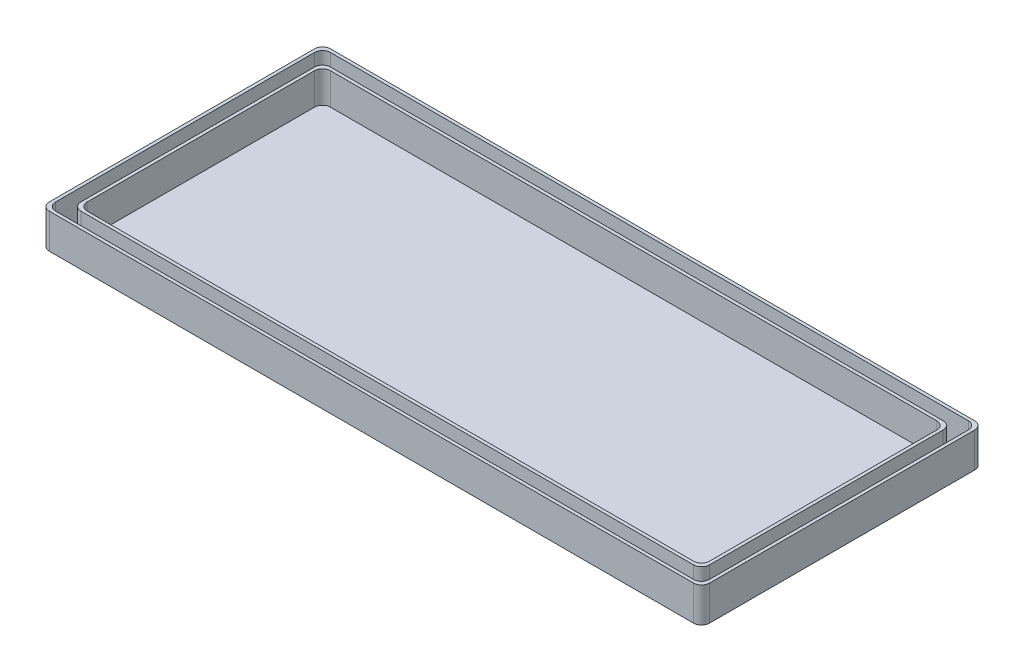
ISO-10303-21;
HEADER;
FILE_DESCRIPTION(('STEP AP214'),'2;1');
FILE_NAME('part.step','',(''),(''),'','','');
FILE_SCHEMA(('AUTOMOTIVE_DESIGN { 1 0 10303 214 1 1 1 1 }'));
ENDSEC;
DATA;
#1=APPLICATION_CONTEXT('core data for automotive mechanical design processes');
#2=APPLICATION_PROTOCOL_DEFINITION('international standard','automotive_design',2000,#1);
#3=PRODUCT_CONTEXT('',#1,'mechanical');
#4=PRODUCT('Part','Part','',(#3));
#5=PRODUCT_RELATED_PRODUCT_CATEGORY('part','',(#4));
#6=PRODUCT_DEFINITION_FORMATION('','',#4);
#7=PRODUCT_DEFINITION_CONTEXT('part definition',#1,'design');
#8=PRODUCT_DEFINITION('design','',#6,#7);
#9=PRODUCT_DEFINITION_SHAPE('','',#8);
#10=(LENGTH_UNIT() NAMED_UNIT(*) SI_UNIT(.MILLI.,.METRE.));
#11=(NAMED_UNIT(*) PLANE_ANGLE_UNIT() SI_UNIT($,.RADIAN.));
#12=(NAMED_UNIT(*) SI_UNIT($,.STERADIAN.) SOLID_ANGLE_UNIT());
#13=UNCERTAINTY_MEASURE_WITH_UNIT(LENGTH_MEASURE(1.E-05),#10,'distance_accuracy_value','');
#14=(GEOMETRIC_REPRESENTATION_CONTEXT(3) GLOBAL_UNCERTAINTY_ASSIGNED_CONTEXT((#13)) GLOBAL_UNIT_ASSIGNED_CONTEXT((#10,
#11,#12)) REPRESENTATION_CONTEXT('',''));
#15=CARTESIAN_POINT('',(0.,0.,0.));
#16=DIRECTION('',(0.,0.,1.));
#17=DIRECTION('',(1.,0.,0.));
#18=AXIS2_PLACEMENT_3D('',#15,#16,#17);
#19=CARTESIAN_POINT('',(0.,0.,0.));
#20=DIRECTION('',(0.,1.,0.));
#21=DIRECTION('',(0.,0.,1.));
#22=AXIS2_PLACEMENT_3D('',#19,#20,#21);
#23=PLANE('',#22);
#24=DIRECTION('',(0.,0.,1.));
#25=VECTOR('',#24,1.);
#26=CARTESIAN_POINT('',(-41.4,0.,17.4));
#27=LINE('',#26,#25);
#28=CARTESIAN_POINT('',(-41.4,0.,-16.4));
#29=VERTEX_POINT('',#28);
#30=CARTESIAN_POINT('',(-41.4,0.,16.4));
#31=VERTEX_POINT('',#30);
#32=EDGE_CURVE('E501',#29,#31,#27,.T.);
#33=ORIENTED_EDGE('',*,*,#32,.T.);
#34=CARTESIAN_POINT('',(-40.4,0.,16.4));
#35=DIRECTION('',(0.,1.,0.));
#36=DIRECTION('',(0.,0.,1.));
#37=AXIS2_PLACEMENT_3D('',#34,#35,#36);
#38=CIRCLE('',#37,1.);
#39=CARTESIAN_POINT('',(-40.4,0.,17.4));
#40=VERTEX_POINT('',#39);
#41=EDGE_CURVE('E350',#31,#40,#38,.T.);
#42=ORIENTED_EDGE('',*,*,#41,.T.);
#43=DIRECTION('',(1.,0.,0.));
#44=VECTOR('',#43,1.);
#45=CARTESIAN_POINT('',(41.4,0.,17.4));
#46=LINE('',#45,#44);
#47=CARTESIAN_POINT('',(40.4,0.,17.4));
#48=VERTEX_POINT('',#47);
#49=EDGE_CURVE('E507',#40,#48,#46,.T.);
#50=ORIENTED_EDGE('',*,*,#49,.T.);
#51=CARTESIAN_POINT('',(40.4,0.,16.4));
#52=DIRECTION('',(0.,1.,0.));
#53=DIRECTION('',(0.,0.,1.));
#54=AXIS2_PLACEMENT_3D('',#51,#52,#53);
#55=CIRCLE('',#54,1.);
#56=CARTESIAN_POINT('',(41.4,0.,16.4));
#57=VERTEX_POINT('',#56);
#58=EDGE_CURVE('E347',#48,#57,#55,.T.);
#59=ORIENTED_EDGE('',*,*,#58,.T.);
#60=DIRECTION('',(0.,0.,-1.));
#61=VECTOR('',#60,1.);
#62=CARTESIAN_POINT('',(41.4,0.,17.4));
#63=LINE('',#62,#61);
#64=CARTESIAN_POINT('',(41.4,0.,-16.4));
#65=VERTEX_POINT('',#64);
#66=EDGE_CURVE('E513',#57,#65,#63,.T.);
#67=ORIENTED_EDGE('',*,*,#66,.T.);
#68=CARTESIAN_POINT('',(40.4,0.,-16.4));
#69=DIRECTION('',(0.,1.,0.));
#70=DIRECTION('',(0.,0.,1.));
#71=AXIS2_PLACEMENT_3D('',#68,#69,#70);
#72=CIRCLE('',#71,1.);
#73=CARTESIAN_POINT('',(40.4,0.,-17.4));
#74=VERTEX_POINT('',#73);
#75=EDGE_CURVE('E344',#65,#74,#72,.T.);
#76=ORIENTED_EDGE('',*,*,#75,.T.);
#77=DIRECTION('',(-1.,0.,0.));
#78=VECTOR('',#77,1.);
#79=CARTESIAN_POINT('',(41.4,0.,-17.4));
#80=LINE('',#79,#78);
#81=CARTESIAN_POINT('',(-40.4,0.,-17.4));
#82=VERTEX_POINT('',#81);
#83=EDGE_CURVE('E502',#74,#82,#80,.T.);
#84=ORIENTED_EDGE('',*,*,#83,.T.);
#85=CARTESIAN_POINT('',(-40.4,0.,-16.4));
#86=DIRECTION('',(0.,1.,0.));
#87=DIRECTION('',(0.,0.,1.));
#88=AXIS2_PLACEMENT_3D('',#85,#86,#87);
#89=CIRCLE('',#88,1.);
#90=EDGE_CURVE('E341',#82,#29,#89,.T.);
#91=ORIENTED_EDGE('',*,*,#90,.T.);
#92=EDGE_LOOP('',(#33,#42,#50,#59,#67,#76,#84,#91));
#93=FACE_BOUND('',#92,.T.);
#94=DIRECTION('',(0.,0.,1.));
#95=VECTOR('',#94,1.);
#96=CARTESIAN_POINT('',(-39.8,0.,-15.8));
#97=LINE('',#96,#95);
#98=CARTESIAN_POINT('',(-39.8,0.,-14.8));
#99=VERTEX_POINT('',#98);
#100=CARTESIAN_POINT('',(-39.8,0.,14.8));
#101=VERTEX_POINT('',#100);
#102=EDGE_CURVE('E669',#99,#101,#97,.T.);
#103=ORIENTED_EDGE('',*,*,#102,.F.);
#104=CARTESIAN_POINT('',(-38.8,0.,-14.8));
#105=DIRECTION('',(0.,1.,0.));
#106=DIRECTION('',(0.,0.,1.));
#107=AXIS2_PLACEMENT_3D('',#104,#105,#106);
#108=CIRCLE('',#107,1.);
#109=CARTESIAN_POINT('',(-38.8,0.,-15.8));
#110=VERTEX_POINT('',#109);
#111=EDGE_CURVE('E471',#99,#110,#108,.F.);
#112=ORIENTED_EDGE('',*,*,#111,.T.);
#113=DIRECTION('',(-1.,0.,0.));
#114=VECTOR('',#113,1.);
#115=CARTESIAN_POINT('',(39.8,0.,-15.8));
#116=LINE('',#115,#114);
#117=CARTESIAN_POINT('',(38.8,0.,-15.8));
#118=VERTEX_POINT('',#117);
#119=EDGE_CURVE('E661',#118,#110,#116,.T.);
#120=ORIENTED_EDGE('',*,*,#119,.F.);
#121=CARTESIAN_POINT('',(38.8,0.,-14.8));
#122=DIRECTION('',(0.,1.,0.));
#123=DIRECTION('',(0.,0.,1.));
#124=AXIS2_PLACEMENT_3D('',#121,#122,#123);
#125=CIRCLE('',#124,1.);
#126=CARTESIAN_POINT('',(39.8,0.,-14.8));
#127=VERTEX_POINT('',#126);
#128=EDGE_CURVE('E468',#118,#127,#125,.F.);
#129=ORIENTED_EDGE('',*,*,#128,.T.);
#130=DIRECTION('',(0.,0.,-1.));
#131=VECTOR('',#130,1.);
#132=CARTESIAN_POINT('',(39.8,0.,15.8));
#133=LINE('',#132,#131);
#134=CARTESIAN_POINT('',(39.8,0.,14.8));
#135=VERTEX_POINT('',#134);
#136=EDGE_CURVE('E652',#135,#127,#133,.T.);
#137=ORIENTED_EDGE('',*,*,#136,.F.);
#138=CARTESIAN_POINT('',(38.8,0.,14.8));
#139=DIRECTION('',(0.,1.,0.));
#140=DIRECTION('',(0.,0.,1.));
#141=AXIS2_PLACEMENT_3D('',#138,#139,#140);
#142=CIRCLE('',#141,1.);
#143=CARTESIAN_POINT('',(38.8,0.,15.8));
#144=VERTEX_POINT('',#143);
#145=EDGE_CURVE('E459',#135,#144,#142,.F.);
#146=ORIENTED_EDGE('',*,*,#145,.T.);
#147=DIRECTION('',(1.,0.,0.));
#148=VECTOR('',#147,1.);
#149=CARTESIAN_POINT('',(-39.8,0.,15.8));
#150=LINE('',#149,#148);
#151=CARTESIAN_POINT('',(-38.8,0.,15.8));
#152=VERTEX_POINT('',#151);
#153=EDGE_CURVE('E665',#152,#144,#150,.T.);
#154=ORIENTED_EDGE('',*,*,#153,.F.);
#155=CARTESIAN_POINT('',(-38.8,0.,14.8));
#156=DIRECTION('',(0.,1.,0.));
#157=DIRECTION('',(0.,0.,1.));
#158=AXIS2_PLACEMENT_3D('',#155,#156,#157);
#159=CIRCLE('',#158,1.);
#160=EDGE_CURVE('E450',#152,#101,#159,.F.);
#161=ORIENTED_EDGE('',*,*,#160,.T.);
#162=EDGE_LOOP('',(#103,#112,#120,#129,#137,#146,#154,#161));
#163=FACE_BOUND('',#162,.T.);
#164=ADVANCED_FACE('F39',(#93,#163),#23,.T.);
#165=CARTESIAN_POINT('',(-41.8,4.,17.4));
#166=DIRECTION('',(1.,0.,0.));
#167=DIRECTION('',(0.,0.,-1.));
#168=AXIS2_PLACEMENT_3D('',#165,#166,#167);
#169=PLANE('',#168);
#170=DIRECTION('',(0.,0.,1.));
#171=VECTOR('',#170,1.);
#172=CARTESIAN_POINT('',(-41.8,-0.4,17.4));
#173=LINE('',#172,#171);
#174=CARTESIAN_POINT('',(-41.8,-0.4,-16.8));
#175=VERTEX_POINT('',#174);
#176=CARTESIAN_POINT('',(-41.8,-0.4,16.8));
#177=VERTEX_POINT('',#176);
#178=EDGE_CURVE('E493',#175,#177,#173,.T.);
#179=ORIENTED_EDGE('',*,*,#178,.T.);
#180=DIRECTION('',(0.,-1.,0.));
#181=VECTOR('',#180,1.);
#182=CARTESIAN_POINT('',(-41.8,4.,16.8));
#183=LINE('',#182,#181);
#184=CARTESIAN_POINT('',(-41.8,4.,16.8));
#185=VERTEX_POINT('',#184);
#186=EDGE_CURVE('E383',#177,#185,#183,.F.);
#187=ORIENTED_EDGE('',*,*,#186,.T.);
#188=DIRECTION('',(0.,0.,1.));
#189=VECTOR('',#188,1.);
#190=CARTESIAN_POINT('',(-41.8,4.,17.4));
#191=LINE('',#190,#189);
#192=CARTESIAN_POINT('',(-41.8,4.,-16.8));
#193=VERTEX_POINT('',#192);
#194=EDGE_CURVE('E539',#193,#185,#191,.T.);
#195=ORIENTED_EDGE('',*,*,#194,.F.);
#196=DIRECTION('',(0.,-1.,0.));
#197=VECTOR('',#196,1.);
#198=CARTESIAN_POINT('',(-41.8,4.,-16.8));
#199=LINE('',#198,#197);
#200=EDGE_CURVE('E379',#193,#175,#199,.T.);
#201=ORIENTED_EDGE('',*,*,#200,.T.);
#202=EDGE_LOOP('',(#179,#187,#195,#201));
#203=FACE_BOUND('',#202,.T.);
#204=ADVANCED_FACE('F568',(#203),#169,.F.);
#205=CARTESIAN_POINT('',(41.4,4.,17.8));
#206=DIRECTION('',(0.,0.,-1.));
#207=DIRECTION('',(-1.,0.,0.));
#208=AXIS2_PLACEMENT_3D('',#205,#206,#207);
#209=PLANE('',#208);
#210=DIRECTION('',(1.,0.,0.));
#211=VECTOR('',#210,1.);
#212=CARTESIAN_POINT('',(41.4,4.,17.8));
#213=LINE('',#212,#211);
#214=CARTESIAN_POINT('',(-40.8,4.,17.8));
#215=VERTEX_POINT('',#214);
#216=CARTESIAN_POINT('',(40.8,4.,17.8));
#217=VERTEX_POINT('',#216);
#218=EDGE_CURVE('E543',#215,#217,#213,.T.);
#219=ORIENTED_EDGE('',*,*,#218,.F.);
#220=DIRECTION('',(0.,-1.,0.));
#221=VECTOR('',#220,1.);
#222=CARTESIAN_POINT('',(-40.8,4.,17.8));
#223=LINE('',#222,#221);
#224=CARTESIAN_POINT('',(-40.8,-0.4,17.8));
#225=VERTEX_POINT('',#224);
#226=EDGE_CURVE('E363',#215,#225,#223,.T.);
#227=ORIENTED_EDGE('',*,*,#226,.T.);
#228=DIRECTION('',(1.,0.,0.));
#229=VECTOR('',#228,1.);
#230=CARTESIAN_POINT('',(41.4,-0.4,17.8));
#231=LINE('',#230,#229);
#232=CARTESIAN_POINT('',(40.8,-0.4,17.8));
#233=VERTEX_POINT('',#232);
#234=EDGE_CURVE('E528',#225,#233,#231,.T.);
#235=ORIENTED_EDGE('',*,*,#234,.T.);
#236=DIRECTION('',(0.,-1.,0.));
#237=VECTOR('',#236,1.);
#238=CARTESIAN_POINT('',(40.8,4.,17.8));
#239=LINE('',#238,#237);
#240=EDGE_CURVE('E360',#233,#217,#239,.F.);
#241=ORIENTED_EDGE('',*,*,#240,.T.);
#242=EDGE_LOOP('',(#219,#227,#235,#241));
#243=FACE_BOUND('',#242,.T.);
#244=ADVANCED_FACE('F576',(#243),#209,.F.);
#245=CARTESIAN_POINT('',(41.8,4.,17.4));
#246=DIRECTION('',(-1.,0.,0.));
#247=DIRECTION('',(0.,0.,1.));
#248=AXIS2_PLACEMENT_3D('',#245,#246,#247);
#249=PLANE('',#248);
#250=DIRECTION('',(0.,0.,-1.));
#251=VECTOR('',#250,1.);
#252=CARTESIAN_POINT('',(41.8,4.,17.4));
#253=LINE('',#252,#251);
#254=CARTESIAN_POINT('',(41.8,4.,16.8));
#255=VERTEX_POINT('',#254);
#256=CARTESIAN_POINT('',(41.8,4.,-16.8));
#257=VERTEX_POINT('',#256);
#258=EDGE_CURVE('E285',#255,#257,#253,.T.);
#259=ORIENTED_EDGE('',*,*,#258,.F.);
#260=DIRECTION('',(0.,-1.,0.));
#261=VECTOR('',#260,1.);
#262=CARTESIAN_POINT('',(41.8,4.,16.8));
#263=LINE('',#262,#261);
#264=CARTESIAN_POINT('',(41.8,-0.4,16.8));
#265=VERTEX_POINT('',#264);
#266=EDGE_CURVE('E414',#255,#265,#263,.T.);
#267=ORIENTED_EDGE('',*,*,#266,.T.);
#268=DIRECTION('',(0.,0.,-1.));
#269=VECTOR('',#268,1.);
#270=CARTESIAN_POINT('',(41.8,-0.4,17.4));
#271=LINE('',#270,#269);
#272=CARTESIAN_POINT('',(41.8,-0.4,-16.8));
#273=VERTEX_POINT('',#272);
#274=EDGE_CURVE('E532',#265,#273,#271,.T.);
#275=ORIENTED_EDGE('',*,*,#274,.T.);
#276=DIRECTION('',(0.,-1.,0.));
#277=VECTOR('',#276,1.);
#278=CARTESIAN_POINT('',(41.8,4.,-16.8));
#279=LINE('',#278,#277);
#280=EDGE_CURVE('E411',#273,#257,#279,.F.);
#281=ORIENTED_EDGE('',*,*,#280,.T.);
#282=EDGE_LOOP('',(#259,#267,#275,#281));
#283=FACE_BOUND('',#282,.T.);
#284=ADVANCED_FACE('F580',(#283),#249,.F.);
#285=CARTESIAN_POINT('',(41.4,4.,-17.8));
#286=DIRECTION('',(0.,0.,1.));
#287=DIRECTION('',(1.,0.,0.));
#288=AXIS2_PLACEMENT_3D('',#285,#286,#287);
#289=PLANE('',#288);
#290=DIRECTION('',(-1.,0.,0.));
#291=VECTOR('',#290,1.);
#292=CARTESIAN_POINT('',(41.4,4.,-17.8));
#293=LINE('',#292,#291);
#294=CARTESIAN_POINT('',(40.8,4.,-17.8));
#295=VERTEX_POINT('',#294);
#296=CARTESIAN_POINT('',(-40.8,4.,-17.8));
#297=VERTEX_POINT('',#296);
#298=EDGE_CURVE('E279',#295,#297,#293,.T.);
#299=ORIENTED_EDGE('',*,*,#298,.F.);
#300=DIRECTION('',(0.,-1.,0.));
#301=VECTOR('',#300,1.);
#302=CARTESIAN_POINT('',(40.8,4.,-17.8));
#303=LINE('',#302,#301);
#304=CARTESIAN_POINT('',(40.8,-0.4,-17.8));
#305=VERTEX_POINT('',#304);
#306=EDGE_CURVE('E420',#295,#305,#303,.T.);
#307=ORIENTED_EDGE('',*,*,#306,.T.);
#308=DIRECTION('',(-1.,0.,0.));
#309=VECTOR('',#308,1.);
#310=CARTESIAN_POINT('',(41.4,-0.4,-17.8));
#311=LINE('',#310,#309);
#312=CARTESIAN_POINT('',(-40.8,-0.4,-17.8));
#313=VERTEX_POINT('',#312);
#314=EDGE_CURVE('E536',#305,#313,#311,.T.);
#315=ORIENTED_EDGE('',*,*,#314,.T.);
#316=DIRECTION('',(0.,-1.,0.));
#317=VECTOR('',#316,1.);
#318=CARTESIAN_POINT('',(-40.8,4.,-17.8));
#319=LINE('',#318,#317);
#320=EDGE_CURVE('E55',#313,#297,#319,.F.);
#321=ORIENTED_EDGE('',*,*,#320,.T.);
#322=EDGE_LOOP('',(#299,#307,#315,#321));
#323=FACE_BOUND('',#322,.T.);
#324=ADVANCED_FACE('F556',(#323),#289,.F.);
#325=CARTESIAN_POINT('',(0.,4.,0.));
#326=DIRECTION('',(0.,1.,0.));
#327=DIRECTION('',(0.,0.,1.));
#328=AXIS2_PLACEMENT_3D('',#325,#326,#327);
#329=PLANE('',#328);
#330=DIRECTION('',(0.,0.,1.));
#331=VECTOR('',#330,1.);
#332=CARTESIAN_POINT('',(-41.4,4.,17.4));
#333=LINE('',#332,#331);
#334=CARTESIAN_POINT('',(-41.4,4.,-16.4));
#335=VERTEX_POINT('',#334);
#336=CARTESIAN_POINT('',(-41.4,4.,16.4));
#337=VERTEX_POINT('',#336);
#338=EDGE_CURVE('E483',#335,#337,#333,.T.);
#339=ORIENTED_EDGE('',*,*,#338,.F.);
#340=CARTESIAN_POINT('',(-40.4,4.,-16.4));
#341=DIRECTION('',(0.,1.,0.));
#342=DIRECTION('',(0.,0.,1.));
#343=AXIS2_PLACEMENT_3D('',#340,#341,#342);
#344=CIRCLE('',#343,1.);
#345=CARTESIAN_POINT('',(-40.4,4.,-17.4));
#346=VERTEX_POINT('',#345);
#347=EDGE_CURVE('E48',#335,#346,#344,.F.);
#348=ORIENTED_EDGE('',*,*,#347,.T.);
#349=DIRECTION('',(-1.,0.,0.));
#350=VECTOR('',#349,1.);
#351=CARTESIAN_POINT('',(41.4,4.,-17.4));
#352=LINE('',#351,#350);
#353=CARTESIAN_POINT('',(40.4,4.,-17.4));
#354=VERTEX_POINT('',#353);
#355=EDGE_CURVE('E480',#354,#346,#352,.T.);
#356=ORIENTED_EDGE('',*,*,#355,.F.);
#357=CARTESIAN_POINT('',(40.4,4.,-16.4));
#358=DIRECTION('',(0.,1.,0.));
#359=DIRECTION('',(0.,0.,1.));
#360=AXIS2_PLACEMENT_3D('',#357,#358,#359);
#361=CIRCLE('',#360,1.);
#362=CARTESIAN_POINT('',(41.4,4.,-16.4));
#363=VERTEX_POINT('',#362);
#364=EDGE_CURVE('E462',#354,#363,#361,.F.);
#365=ORIENTED_EDGE('',*,*,#364,.T.);
#366=DIRECTION('',(0.,0.,-1.));
#367=VECTOR('',#366,1.);
#368=CARTESIAN_POINT('',(41.4,4.,17.4));
#369=LINE('',#368,#367);
#370=CARTESIAN_POINT('',(41.4,4.,16.4));
#371=VERTEX_POINT('',#370);
#372=EDGE_CURVE('E494',#371,#363,#369,.T.);
#373=ORIENTED_EDGE('',*,*,#372,.F.);
#374=CARTESIAN_POINT('',(40.4,4.,16.4));
#375=DIRECTION('',(0.,1.,0.));
#376=DIRECTION('',(0.,0.,1.));
#377=AXIS2_PLACEMENT_3D('',#374,#375,#376);
#378=CIRCLE('',#377,1.);
#379=CARTESIAN_POINT('',(40.4,4.,17.4));
#380=VERTEX_POINT('',#379);
#381=EDGE_CURVE('E456',#371,#380,#378,.F.);
#382=ORIENTED_EDGE('',*,*,#381,.T.);
#383=DIRECTION('',(1.,0.,0.));
#384=VECTOR('',#383,1.);
#385=CARTESIAN_POINT('',(41.4,4.,17.4));
#386=LINE('',#385,#384);
#387=CARTESIAN_POINT('',(-40.4,4.,17.4));
#388=VERTEX_POINT('',#387);
#389=EDGE_CURVE('E675',#388,#380,#386,.T.);
#390=ORIENTED_EDGE('',*,*,#389,.F.);
#391=CARTESIAN_POINT('',(-40.4,4.,16.4));
#392=DIRECTION('',(0.,1.,0.));
#393=DIRECTION('',(0.,0.,1.));
#394=AXIS2_PLACEMENT_3D('',#391,#392,#393);
#395=CIRCLE('',#394,1.);
#396=EDGE_CURVE('E453',#388,#337,#395,.F.);
#397=ORIENTED_EDGE('',*,*,#396,.T.);
#398=EDGE_LOOP('',(#339,#348,#356,#365,#373,#382,#390,#397));
#399=FACE_BOUND('',#398,.T.);
#400=ORIENTED_EDGE('',*,*,#194,.T.);
#401=CARTESIAN_POINT('',(-40.8,4.,16.8));
#402=DIRECTION('',(0.,1.,0.));
#403=DIRECTION('',(0.,0.,1.));
#404=AXIS2_PLACEMENT_3D('',#401,#402,#403);
#405=CIRCLE('',#404,1.);
#406=EDGE_CURVE('E394',#185,#215,#405,.T.);
#407=ORIENTED_EDGE('',*,*,#406,.T.);
#408=ORIENTED_EDGE('',*,*,#218,.T.);
#409=CARTESIAN_POINT('',(40.8,4.,16.8));
#410=DIRECTION('',(0.,1.,0.));
#411=DIRECTION('',(0.,0.,1.));
#412=AXIS2_PLACEMENT_3D('',#409,#410,#411);
#413=CIRCLE('',#412,1.);
#414=EDGE_CURVE('E391',#217,#255,#413,.T.);
#415=ORIENTED_EDGE('',*,*,#414,.T.);
#416=ORIENTED_EDGE('',*,*,#258,.T.);
#417=CARTESIAN_POINT('',(40.8,4.,-16.8));
#418=DIRECTION('',(0.,1.,0.));
#419=DIRECTION('',(0.,0.,1.));
#420=AXIS2_PLACEMENT_3D('',#417,#418,#419);
#421=CIRCLE('',#420,1.);
#422=EDGE_CURVE('E62',#257,#295,#421,.T.);
#423=ORIENTED_EDGE('',*,*,#422,.T.);
#424=ORIENTED_EDGE('',*,*,#298,.T.);
#425=CARTESIAN_POINT('',(-40.8,4.,-16.8));
#426=DIRECTION('',(0.,1.,0.));
#427=DIRECTION('',(0.,0.,1.));
#428=AXIS2_PLACEMENT_3D('',#425,#426,#427);
#429=CIRCLE('',#428,1.);
#430=EDGE_CURVE('E386',#297,#193,#429,.T.);
#431=ORIENTED_EDGE('',*,*,#430,.T.);
#432=EDGE_LOOP('',(#400,#407,#408,#415,#416,#423,#424,#431));
#433=FACE_BOUND('',#432,.T.);
#434=ADVANCED_FACE('F479',(#399,#433),#329,.T.);
#435=CARTESIAN_POINT('',(0.,-0.4,0.));
#436=DIRECTION('',(0.,1.,0.));
#437=DIRECTION('',(0.,0.,1.));
#438=AXIS2_PLACEMENT_3D('',#435,#436,#437);
#439=PLANE('',#438);
#440=ORIENTED_EDGE('',*,*,#234,.F.);
#441=CARTESIAN_POINT('',(-40.8,-0.4,16.8));
#442=DIRECTION('',(0.,1.,0.));
#443=DIRECTION('',(0.,0.,1.));
#444=AXIS2_PLACEMENT_3D('',#441,#442,#443);
#445=CIRCLE('',#444,1.);
#446=EDGE_CURVE('E376',#225,#177,#445,.F.);
#447=ORIENTED_EDGE('',*,*,#446,.T.);
#448=ORIENTED_EDGE('',*,*,#178,.F.);
#449=CARTESIAN_POINT('',(-40.8,-0.4,-16.8));
#450=DIRECTION('',(0.,1.,0.));
#451=DIRECTION('',(0.,0.,1.));
#452=AXIS2_PLACEMENT_3D('',#449,#450,#451);
#453=CIRCLE('',#452,1.);
#454=EDGE_CURVE('E367',#175,#313,#453,.F.);
#455=ORIENTED_EDGE('',*,*,#454,.T.);
#456=ORIENTED_EDGE('',*,*,#314,.F.);
#457=CARTESIAN_POINT('',(40.8,-0.4,-16.8));
#458=DIRECTION('',(0.,1.,0.));
#459=DIRECTION('',(0.,0.,1.));
#460=AXIS2_PLACEMENT_3D('',#457,#458,#459);
#461=CIRCLE('',#460,1.);
#462=EDGE_CURVE('E370',#305,#273,#461,.F.);
#463=ORIENTED_EDGE('',*,*,#462,.T.);
#464=ORIENTED_EDGE('',*,*,#274,.F.);
#465=CARTESIAN_POINT('',(40.8,-0.4,16.8));
#466=DIRECTION('',(0.,1.,0.));
#467=DIRECTION('',(0.,0.,1.));
#468=AXIS2_PLACEMENT_3D('',#465,#466,#467);
#469=CIRCLE('',#468,1.);
#470=EDGE_CURVE('E373',#265,#233,#469,.F.);
#471=ORIENTED_EDGE('',*,*,#470,.T.);
#472=EDGE_LOOP('',(#440,#447,#448,#455,#456,#463,#464,#471));
#473=FACE_BOUND('',#472,.T.);
#474=ADVANCED_FACE('F559',(#473),#439,.F.);
#475=CARTESIAN_POINT('',(-41.4,4.,17.4));
#476=DIRECTION('',(1.,0.,0.));
#477=DIRECTION('',(0.,0.,-1.));
#478=AXIS2_PLACEMENT_3D('',#475,#476,#477);
#479=PLANE('',#478);
#480=ORIENTED_EDGE('',*,*,#338,.T.);
#481=DIRECTION('',(0.,-1.,0.));
#482=VECTOR('',#481,1.);
#483=CARTESIAN_POINT('',(-41.4,0.,16.4));
#484=LINE('',#483,#482);
#485=EDGE_CURVE('E337',#337,#31,#484,.T.);
#486=ORIENTED_EDGE('',*,*,#485,.T.);
#487=ORIENTED_EDGE('',*,*,#32,.F.);
#488=DIRECTION('',(0.,-1.,0.));
#489=VECTOR('',#488,1.);
#490=CARTESIAN_POINT('',(-41.4,4.,-16.4));
#491=LINE('',#490,#489);
#492=EDGE_CURVE('E334',#29,#335,#491,.F.);
#493=ORIENTED_EDGE('',*,*,#492,.T.);
#494=EDGE_LOOP('',(#480,#486,#487,#493));
#495=FACE_BOUND('',#494,.T.);
#496=ADVANCED_FACE('F504',(#495),#479,.T.);
#497=CARTESIAN_POINT('',(41.4,4.,17.4));
#498=DIRECTION('',(0.,0.,-1.));
#499=DIRECTION('',(-1.,0.,0.));
#500=AXIS2_PLACEMENT_3D('',#497,#498,#499);
#501=PLANE('',#500);
#502=ORIENTED_EDGE('',*,*,#49,.F.);
#503=DIRECTION('',(0.,-1.,0.));
#504=VECTOR('',#503,1.);
#505=CARTESIAN_POINT('',(-40.4,4.,17.4));
#506=LINE('',#505,#504);
#507=EDGE_CURVE('E357',#40,#388,#506,.F.);
#508=ORIENTED_EDGE('',*,*,#507,.T.);
#509=ORIENTED_EDGE('',*,*,#389,.T.);
#510=DIRECTION('',(0.,-1.,0.));
#511=VECTOR('',#510,1.);
#512=CARTESIAN_POINT('',(40.4,0.,17.4));
#513=LINE('',#512,#511);
#514=EDGE_CURVE('E353',#380,#48,#513,.T.);
#515=ORIENTED_EDGE('',*,*,#514,.T.);
#516=EDGE_LOOP('',(#502,#508,#509,#515));
#517=FACE_BOUND('',#516,.T.);
#518=ADVANCED_FACE('F696',(#517),#501,.T.);
#519=CARTESIAN_POINT('',(41.4,4.,17.4));
#520=DIRECTION('',(-1.,0.,0.));
#521=DIRECTION('',(0.,0.,1.));
#522=AXIS2_PLACEMENT_3D('',#519,#520,#521);
#523=PLANE('',#522);
#524=ORIENTED_EDGE('',*,*,#66,.F.);
#525=DIRECTION('',(0.,-1.,0.));
#526=VECTOR('',#525,1.);
#527=CARTESIAN_POINT('',(41.4,4.,16.4));
#528=LINE('',#527,#526);
#529=EDGE_CURVE('E401',#57,#371,#528,.F.);
#530=ORIENTED_EDGE('',*,*,#529,.T.);
#531=ORIENTED_EDGE('',*,*,#372,.T.);
#532=DIRECTION('',(0.,-1.,0.));
#533=VECTOR('',#532,1.);
#534=CARTESIAN_POINT('',(41.4,0.,-16.4));
#535=LINE('',#534,#533);
#536=EDGE_CURVE('E397',#363,#65,#535,.T.);
#537=ORIENTED_EDGE('',*,*,#536,.T.);
#538=EDGE_LOOP('',(#524,#530,#531,#537));
#539=FACE_BOUND('',#538,.T.);
#540=ADVANCED_FACE('F684',(#539),#523,.T.);
#541=CARTESIAN_POINT('',(41.4,4.,-17.4));
#542=DIRECTION('',(0.,0.,1.));
#543=DIRECTION('',(1.,0.,0.));
#544=AXIS2_PLACEMENT_3D('',#541,#542,#543);
#545=PLANE('',#544);
#546=ORIENTED_EDGE('',*,*,#83,.F.);
#547=DIRECTION('',(0.,-1.,0.));
#548=VECTOR('',#547,1.);
#549=CARTESIAN_POINT('',(40.4,4.,-17.4));
#550=LINE('',#549,#548);
#551=EDGE_CURVE('E428',#74,#354,#550,.F.);
#552=ORIENTED_EDGE('',*,*,#551,.T.);
#553=ORIENTED_EDGE('',*,*,#355,.T.);
#554=DIRECTION('',(0.,-1.,0.));
#555=VECTOR('',#554,1.);
#556=CARTESIAN_POINT('',(-40.4,0.,-17.4));
#557=LINE('',#556,#555);
#558=EDGE_CURVE('E424',#346,#82,#557,.T.);
#559=ORIENTED_EDGE('',*,*,#558,.T.);
#560=EDGE_LOOP('',(#546,#552,#553,#559));
#561=FACE_BOUND('',#560,.T.);
#562=ADVANCED_FACE('F489',(#561),#545,.T.);
#563=CARTESIAN_POINT('',(0.,4.,0.));
#564=DIRECTION('',(0.,1.,0.));
#565=DIRECTION('',(0.,0.,1.));
#566=AXIS2_PLACEMENT_3D('',#563,#564,#565);
#567=PLANE('',#566);
#568=DIRECTION('',(0.,0.,1.));
#569=VECTOR('',#568,1.);
#570=CARTESIAN_POINT('',(-39.8,4.,-15.8));
#571=LINE('',#570,#569);
#572=CARTESIAN_POINT('',(-39.8,4.,-14.8));
#573=VERTEX_POINT('',#572);
#574=CARTESIAN_POINT('',(-39.8,4.,14.8));
#575=VERTEX_POINT('',#574);
#576=EDGE_CURVE('E651',#573,#575,#571,.T.);
#577=ORIENTED_EDGE('',*,*,#576,.T.);
#578=CARTESIAN_POINT('',(-38.8,4.,14.8));
#579=DIRECTION('',(0.,1.,0.));
#580=DIRECTION('',(0.,0.,1.));
#581=AXIS2_PLACEMENT_3D('',#578,#579,#580);
#582=CIRCLE('',#581,1.);
#583=CARTESIAN_POINT('',(-38.8,4.,15.8));
#584=VERTEX_POINT('',#583);
#585=EDGE_CURVE('E331',#575,#584,#582,.T.);
#586=ORIENTED_EDGE('',*,*,#585,.T.);
#587=DIRECTION('',(1.,0.,0.));
#588=VECTOR('',#587,1.);
#589=CARTESIAN_POINT('',(-39.8,4.,15.8));
#590=LINE('',#589,#588);
#591=CARTESIAN_POINT('',(38.8,4.,15.8));
#592=VERTEX_POINT('',#591);
#593=EDGE_CURVE('E516',#584,#592,#590,.T.);
#594=ORIENTED_EDGE('',*,*,#593,.T.);
#595=CARTESIAN_POINT('',(38.8,4.,14.8));
#596=DIRECTION('',(0.,1.,0.));
#597=DIRECTION('',(0.,0.,1.));
#598=AXIS2_PLACEMENT_3D('',#595,#596,#597);
#599=CIRCLE('',#598,1.);
#600=CARTESIAN_POINT('',(39.8,4.,14.8));
#601=VERTEX_POINT('',#600);
#602=EDGE_CURVE('E328',#592,#601,#599,.T.);
#603=ORIENTED_EDGE('',*,*,#602,.T.);
#604=DIRECTION('',(0.,0.,-1.));
#605=VECTOR('',#604,1.);
#606=CARTESIAN_POINT('',(39.8,4.,15.8));
#607=LINE('',#606,#605);
#608=CARTESIAN_POINT('',(39.8,4.,-14.8));
#609=VERTEX_POINT('',#608);
#610=EDGE_CURVE('E508',#601,#609,#607,.T.);
#611=ORIENTED_EDGE('',*,*,#610,.T.);
#612=CARTESIAN_POINT('',(38.8,4.,-14.8));
#613=DIRECTION('',(0.,1.,0.));
#614=DIRECTION('',(0.,0.,1.));
#615=AXIS2_PLACEMENT_3D('',#612,#613,#614);
#616=CIRCLE('',#615,1.);
#617=CARTESIAN_POINT('',(38.8,4.,-15.8));
#618=VERTEX_POINT('',#617);
#619=EDGE_CURVE('E325',#609,#618,#616,.T.);
#620=ORIENTED_EDGE('',*,*,#619,.T.);
#621=DIRECTION('',(-1.,0.,0.));
#622=VECTOR('',#621,1.);
#623=CARTESIAN_POINT('',(39.8,4.,-15.8));
#624=LINE('',#623,#622);
#625=CARTESIAN_POINT('',(-38.8,4.,-15.8));
#626=VERTEX_POINT('',#625);
#627=EDGE_CURVE('E644',#618,#626,#624,.T.);
#628=ORIENTED_EDGE('',*,*,#627,.T.);
#629=CARTESIAN_POINT('',(-38.8,4.,-14.8));
#630=DIRECTION('',(0.,1.,0.));
#631=DIRECTION('',(0.,0.,1.));
#632=AXIS2_PLACEMENT_3D('',#629,#630,#631);
#633=CIRCLE('',#632,1.);
#634=EDGE_CURVE('E322',#626,#573,#633,.T.);
#635=ORIENTED_EDGE('',*,*,#634,.T.);
#636=EDGE_LOOP('',(#577,#586,#594,#603,#611,#620,#628,#635));
#637=FACE_BOUND('',#636,.T.);
#638=DIRECTION('',(0.,0.,1.));
#639=VECTOR('',#638,1.);
#640=CARTESIAN_POINT('',(-39.4,4.,-15.4));
#641=LINE('',#640,#639);
#642=CARTESIAN_POINT('',(-39.4,4.,-14.4));
#643=VERTEX_POINT('',#642);
#644=CARTESIAN_POINT('',(-39.4,4.,14.4));
#645=VERTEX_POINT('',#644);
#646=EDGE_CURVE('E752',#643,#645,#641,.T.);
#647=ORIENTED_EDGE('',*,*,#646,.F.);
#648=CARTESIAN_POINT('',(-38.4,4.,-14.4));
#649=DIRECTION('',(0.,1.,0.));
#650=DIRECTION('',(0.,0.,1.));
#651=AXIS2_PLACEMENT_3D('',#648,#649,#650);
#652=CIRCLE('',#651,1.);
#653=CARTESIAN_POINT('',(-38.4,4.,-15.4));
#654=VERTEX_POINT('',#653);
#655=EDGE_CURVE('E11',#643,#654,#652,.F.);
#656=ORIENTED_EDGE('',*,*,#655,.T.);
#657=DIRECTION('',(-1.,0.,0.));
#658=VECTOR('',#657,1.);
#659=CARTESIAN_POINT('',(39.4,4.,-15.4));
#660=LINE('',#659,#658);
#661=CARTESIAN_POINT('',(38.4,4.,-15.4));
#662=VERTEX_POINT('',#661);
#663=EDGE_CURVE('E749',#662,#654,#660,.T.);
#664=ORIENTED_EDGE('',*,*,#663,.F.);
#665=CARTESIAN_POINT('',(38.4,4.,-14.4));
#666=DIRECTION('',(0.,1.,0.));
#667=DIRECTION('',(0.,0.,1.));
#668=AXIS2_PLACEMENT_3D('',#665,#666,#667);
#669=CIRCLE('',#668,1.);
#670=CARTESIAN_POINT('',(39.4,4.,-14.4));
#671=VERTEX_POINT('',#670);
#672=EDGE_CURVE('E465',#662,#671,#669,.F.);
#673=ORIENTED_EDGE('',*,*,#672,.T.);
#674=DIRECTION('',(0.,0.,-1.));
#675=VECTOR('',#674,1.);
#676=CARTESIAN_POINT('',(39.4,4.,15.4));
#677=LINE('',#676,#675);
#678=CARTESIAN_POINT('',(39.4,4.,14.4));
#679=VERTEX_POINT('',#678);
#680=EDGE_CURVE('E767',#679,#671,#677,.T.);
#681=ORIENTED_EDGE('',*,*,#680,.F.);
#682=CARTESIAN_POINT('',(38.4,4.,14.4));
#683=DIRECTION('',(0.,1.,0.));
#684=DIRECTION('',(0.,0.,1.));
#685=AXIS2_PLACEMENT_3D('',#682,#683,#684);
#686=CIRCLE('',#685,1.);
#687=CARTESIAN_POINT('',(38.4,4.,15.4));
#688=VERTEX_POINT('',#687);
#689=EDGE_CURVE('E445',#679,#688,#686,.F.);
#690=ORIENTED_EDGE('',*,*,#689,.T.);
#691=DIRECTION('',(1.,0.,0.));
#692=VECTOR('',#691,1.);
#693=CARTESIAN_POINT('',(-39.4,4.,15.4));
#694=LINE('',#693,#692);
#695=CARTESIAN_POINT('',(-38.4,4.,15.4));
#696=VERTEX_POINT('',#695);
#697=EDGE_CURVE('E760',#696,#688,#694,.T.);
#698=ORIENTED_EDGE('',*,*,#697,.F.);
#699=CARTESIAN_POINT('',(-38.4,4.,14.4));
#700=DIRECTION('',(0.,1.,0.));
#701=DIRECTION('',(0.,0.,1.));
#702=AXIS2_PLACEMENT_3D('',#699,#700,#701);
#703=CIRCLE('',#702,1.);
#704=EDGE_CURVE('E277',#696,#645,#703,.F.);
#705=ORIENTED_EDGE('',*,*,#704,.T.);
#706=EDGE_LOOP('',(#647,#656,#664,#673,#681,#690,#698,#705));
#707=FACE_BOUND('',#706,.T.);
#708=ADVANCED_FACE('F623',(#637,#707),#567,.T.);
#709=CARTESIAN_POINT('',(39.8,4.,-15.8));
#710=DIRECTION('',(0.,0.,1.));
#711=DIRECTION('',(1.,0.,0.));
#712=AXIS2_PLACEMENT_3D('',#709,#710,#711);
#713=PLANE('',#712);
#714=ORIENTED_EDGE('',*,*,#627,.F.);
#715=DIRECTION('',(0.,-1.,0.));
#716=VECTOR('',#715,1.);
#717=CARTESIAN_POINT('',(38.8,4.,-15.8));
#718=LINE('',#717,#716);
#719=EDGE_CURVE('E441',#618,#118,#718,.T.);
#720=ORIENTED_EDGE('',*,*,#719,.T.);
#721=ORIENTED_EDGE('',*,*,#119,.T.);
#722=DIRECTION('',(0.,-1.,0.));
#723=VECTOR('',#722,1.);
#724=CARTESIAN_POINT('',(-38.8,4.,-15.8));
#725=LINE('',#724,#723);
#726=EDGE_CURVE('E438',#110,#626,#725,.F.);
#727=ORIENTED_EDGE('',*,*,#726,.T.);
#728=EDGE_LOOP('',(#714,#720,#721,#727));
#729=FACE_BOUND('',#728,.T.);
#730=ADVANCED_FACE('F626',(#729),#713,.F.);
#731=CARTESIAN_POINT('',(-39.8,4.,-15.8));
#732=DIRECTION('',(1.,0.,0.));
#733=DIRECTION('',(0.,0.,-1.));
#734=AXIS2_PLACEMENT_3D('',#731,#732,#733);
#735=PLANE('',#734);
#736=ORIENTED_EDGE('',*,*,#102,.T.);
#737=DIRECTION('',(0.,-1.,0.));
#738=VECTOR('',#737,1.);
#739=CARTESIAN_POINT('',(-39.8,4.,14.8));
#740=LINE('',#739,#738);
#741=EDGE_CURVE('E319',#101,#575,#740,.F.);
#742=ORIENTED_EDGE('',*,*,#741,.T.);
#743=ORIENTED_EDGE('',*,*,#576,.F.);
#744=DIRECTION('',(0.,-1.,0.));
#745=VECTOR('',#744,1.);
#746=CARTESIAN_POINT('',(-39.8,4.,-14.8));
#747=LINE('',#746,#745);
#748=EDGE_CURVE('E315',#573,#99,#747,.T.);
#749=ORIENTED_EDGE('',*,*,#748,.T.);
#750=EDGE_LOOP('',(#736,#742,#743,#749));
#751=FACE_BOUND('',#750,.T.);
#752=ADVANCED_FACE('F634',(#751),#735,.F.);
#753=CARTESIAN_POINT('',(-39.8,4.,15.8));
#754=DIRECTION('',(0.,0.,-1.));
#755=DIRECTION('',(-1.,0.,0.));
#756=AXIS2_PLACEMENT_3D('',#753,#754,#755);
#757=PLANE('',#756);
#758=ORIENTED_EDGE('',*,*,#593,.F.);
#759=DIRECTION('',(0.,-1.,0.));
#760=VECTOR('',#759,1.);
#761=CARTESIAN_POINT('',(-38.8,4.,15.8));
#762=LINE('',#761,#760);
#763=EDGE_CURVE('E311',#584,#152,#762,.T.);
#764=ORIENTED_EDGE('',*,*,#763,.T.);
#765=ORIENTED_EDGE('',*,*,#153,.T.);
#766=DIRECTION('',(0.,-1.,0.));
#767=VECTOR('',#766,1.);
#768=CARTESIAN_POINT('',(38.8,4.,15.8));
#769=LINE('',#768,#767);
#770=EDGE_CURVE('E308',#144,#592,#769,.F.);
#771=ORIENTED_EDGE('',*,*,#770,.T.);
#772=EDGE_LOOP('',(#758,#764,#765,#771));
#773=FACE_BOUND('',#772,.T.);
#774=ADVANCED_FACE('F630',(#773),#757,.F.);
#775=CARTESIAN_POINT('',(39.8,4.,15.8));
#776=DIRECTION('',(-1.,0.,0.));
#777=DIRECTION('',(0.,0.,1.));
#778=AXIS2_PLACEMENT_3D('',#775,#776,#777);
#779=PLANE('',#778);
#780=ORIENTED_EDGE('',*,*,#610,.F.);
#781=DIRECTION('',(0.,-1.,0.));
#782=VECTOR('',#781,1.);
#783=CARTESIAN_POINT('',(39.8,4.,14.8));
#784=LINE('',#783,#782);
#785=EDGE_CURVE('E407',#601,#135,#784,.T.);
#786=ORIENTED_EDGE('',*,*,#785,.T.);
#787=ORIENTED_EDGE('',*,*,#136,.T.);
#788=DIRECTION('',(0.,-1.,0.));
#789=VECTOR('',#788,1.);
#790=CARTESIAN_POINT('',(39.8,4.,-14.8));
#791=LINE('',#790,#789);
#792=EDGE_CURVE('E404',#127,#609,#791,.F.);
#793=ORIENTED_EDGE('',*,*,#792,.T.);
#794=EDGE_LOOP('',(#780,#786,#787,#793));
#795=FACE_BOUND('',#794,.T.);
#796=ADVANCED_FACE('F621',(#795),#779,.F.);
#797=CARTESIAN_POINT('',(39.4,4.,-15.4));
#798=DIRECTION('',(0.,0.,1.));
#799=DIRECTION('',(1.,0.,0.));
#800=AXIS2_PLACEMENT_3D('',#797,#798,#799);
#801=PLANE('',#800);
#802=DIRECTION('',(-1.,0.,0.));
#803=VECTOR('',#802,1.);
#804=CARTESIAN_POINT('',(39.4,0.,-15.4));
#805=LINE('',#804,#803);
#806=CARTESIAN_POINT('',(38.4,0.,-15.4));
#807=VERTEX_POINT('',#806);
#808=CARTESIAN_POINT('',(-38.4,0.,-15.4));
#809=VERTEX_POINT('',#808);
#810=EDGE_CURVE('E771',#807,#809,#805,.T.);
#811=ORIENTED_EDGE('',*,*,#810,.F.);
#812=DIRECTION('',(0.,-1.,0.));
#813=VECTOR('',#812,1.);
#814=CARTESIAN_POINT('',(38.4,4.,-15.4));
#815=LINE('',#814,#813);
#816=EDGE_CURVE('E435',#807,#662,#815,.F.);
#817=ORIENTED_EDGE('',*,*,#816,.T.);
#818=ORIENTED_EDGE('',*,*,#663,.T.);
#819=DIRECTION('',(0.,-1.,0.));
#820=VECTOR('',#819,1.);
#821=CARTESIAN_POINT('',(-38.4,0.,-15.4));
#822=LINE('',#821,#820);
#823=EDGE_CURVE('E431',#654,#809,#822,.T.);
#824=ORIENTED_EDGE('',*,*,#823,.T.);
#825=EDGE_LOOP('',(#811,#817,#818,#824));
#826=FACE_BOUND('',#825,.T.);
#827=ADVANCED_FACE('F617',(#826),#801,.T.);
#828=CARTESIAN_POINT('',(-39.4,4.,-15.4));
#829=DIRECTION('',(1.,0.,0.));
#830=DIRECTION('',(0.,0.,-1.));
#831=AXIS2_PLACEMENT_3D('',#828,#829,#830);
#832=PLANE('',#831);
#833=ORIENTED_EDGE('',*,*,#646,.T.);
#834=DIRECTION('',(0.,-1.,0.));
#835=VECTOR('',#834,1.);
#836=CARTESIAN_POINT('',(-39.4,0.,14.4));
#837=LINE('',#836,#835);
#838=CARTESIAN_POINT('',(-39.4,0.,14.4));
#839=VERTEX_POINT('',#838);
#840=EDGE_CURVE('E305',#645,#839,#837,.T.);
#841=ORIENTED_EDGE('',*,*,#840,.T.);
#842=DIRECTION('',(0.,0.,1.));
#843=VECTOR('',#842,1.);
#844=CARTESIAN_POINT('',(-39.4,0.,-15.4));
#845=LINE('',#844,#843);
#846=CARTESIAN_POINT('',(-39.4,0.,-14.4));
#847=VERTEX_POINT('',#846);
#848=EDGE_CURVE('E255',#847,#839,#845,.T.);
#849=ORIENTED_EDGE('',*,*,#848,.F.);
#850=DIRECTION('',(0.,-1.,0.));
#851=VECTOR('',#850,1.);
#852=CARTESIAN_POINT('',(-39.4,4.,-14.4));
#853=LINE('',#852,#851);
#854=EDGE_CURVE('E302',#847,#643,#853,.F.);
#855=ORIENTED_EDGE('',*,*,#854,.T.);
#856=EDGE_LOOP('',(#833,#841,#849,#855));
#857=FACE_BOUND('',#856,.T.);
#858=ADVANCED_FACE('F611',(#857),#832,.T.);
#859=CARTESIAN_POINT('',(-39.4,4.,15.4));
#860=DIRECTION('',(0.,0.,-1.));
#861=DIRECTION('',(-1.,0.,0.));
#862=AXIS2_PLACEMENT_3D('',#859,#860,#861);
#863=PLANE('',#862);
#864=ORIENTED_EDGE('',*,*,#697,.T.);
#865=DIRECTION('',(0.,-1.,0.));
#866=VECTOR('',#865,1.);
#867=CARTESIAN_POINT('',(38.4,0.,15.4));
#868=LINE('',#867,#866);
#869=CARTESIAN_POINT('',(38.4,0.,15.4));
#870=VERTEX_POINT('',#869);
#871=EDGE_CURVE('E271',#688,#870,#868,.T.);
#872=ORIENTED_EDGE('',*,*,#871,.T.);
#873=DIRECTION('',(1.,0.,0.));
#874=VECTOR('',#873,1.);
#875=CARTESIAN_POINT('',(-39.4,0.,15.4));
#876=LINE('',#875,#874);
#877=CARTESIAN_POINT('',(-38.4,0.,15.4));
#878=VERTEX_POINT('',#877);
#879=EDGE_CURVE('E253',#878,#870,#876,.T.);
#880=ORIENTED_EDGE('',*,*,#879,.F.);
#881=DIRECTION('',(0.,-1.,0.));
#882=VECTOR('',#881,1.);
#883=CARTESIAN_POINT('',(-38.4,4.,15.4));
#884=LINE('',#883,#882);
#885=EDGE_CURVE('E268',#878,#696,#884,.F.);
#886=ORIENTED_EDGE('',*,*,#885,.T.);
#887=EDGE_LOOP('',(#864,#872,#880,#886));
#888=FACE_BOUND('',#887,.T.);
#889=ADVANCED_FACE('F267',(#888),#863,.T.);
#890=CARTESIAN_POINT('',(39.4,4.,15.4));
#891=DIRECTION('',(-1.,0.,0.));
#892=DIRECTION('',(0.,0.,1.));
#893=AXIS2_PLACEMENT_3D('',#890,#891,#892);
#894=PLANE('',#893);
#895=DIRECTION('',(0.,0.,-1.));
#896=VECTOR('',#895,1.);
#897=CARTESIAN_POINT('',(39.4,0.,15.4));
#898=LINE('',#897,#896);
#899=CARTESIAN_POINT('',(39.4,0.,14.4));
#900=VERTEX_POINT('',#899);
#901=CARTESIAN_POINT('',(39.4,0.,-14.4));
#902=VERTEX_POINT('',#901);
#903=EDGE_CURVE('E273',#900,#902,#898,.T.);
#904=ORIENTED_EDGE('',*,*,#903,.F.);
#905=DIRECTION('',(0.,-1.,0.));
#906=VECTOR('',#905,1.);
#907=CARTESIAN_POINT('',(39.4,4.,14.4));
#908=LINE('',#907,#906);
#909=EDGE_CURVE('E299',#900,#679,#908,.F.);
#910=ORIENTED_EDGE('',*,*,#909,.T.);
#911=ORIENTED_EDGE('',*,*,#680,.T.);
#912=DIRECTION('',(0.,-1.,0.));
#913=VECTOR('',#912,1.);
#914=CARTESIAN_POINT('',(39.4,0.,-14.4));
#915=LINE('',#914,#913);
#916=EDGE_CURVE('E295',#671,#902,#915,.T.);
#917=ORIENTED_EDGE('',*,*,#916,.T.);
#918=EDGE_LOOP('',(#904,#910,#911,#917));
#919=FACE_BOUND('',#918,.T.);
#920=ADVANCED_FACE('F599',(#919),#894,.T.);
#921=ORIENTED_EDGE('',*,*,#879,.T.);
#922=CARTESIAN_POINT('',(38.4,0.,14.4));
#923=DIRECTION('',(0.,1.,0.));
#924=DIRECTION('',(0.,0.,1.));
#925=AXIS2_PLACEMENT_3D('',#922,#923,#924);
#926=CIRCLE('',#925,1.);
#927=EDGE_CURVE('E261',#870,#900,#926,.T.);
#928=ORIENTED_EDGE('',*,*,#927,.T.);
#929=ORIENTED_EDGE('',*,*,#903,.T.);
#930=CARTESIAN_POINT('',(38.4,0.,-14.4));
#931=DIRECTION('',(0.,1.,0.));
#932=DIRECTION('',(0.,0.,1.));
#933=AXIS2_PLACEMENT_3D('',#930,#931,#932);
#934=CIRCLE('',#933,1.);
#935=EDGE_CURVE('E262',#902,#807,#934,.T.);
#936=ORIENTED_EDGE('',*,*,#935,.T.);
#937=ORIENTED_EDGE('',*,*,#810,.T.);
#938=CARTESIAN_POINT('',(-38.4,0.,-14.4));
#939=DIRECTION('',(0.,1.,0.));
#940=DIRECTION('',(0.,0.,1.));
#941=AXIS2_PLACEMENT_3D('',#938,#939,#940);
#942=CIRCLE('',#941,1.);
#943=EDGE_CURVE('E283',#809,#847,#942,.T.);
#944=ORIENTED_EDGE('',*,*,#943,.T.);
#945=ORIENTED_EDGE('',*,*,#848,.T.);
#946=CARTESIAN_POINT('',(-38.4,0.,14.4));
#947=DIRECTION('',(0.,1.,0.));
#948=DIRECTION('',(0.,0.,1.));
#949=AXIS2_PLACEMENT_3D('',#946,#947,#948);
#950=CIRCLE('',#949,1.);
#951=EDGE_CURVE('E250',#839,#878,#950,.T.);
#952=ORIENTED_EDGE('',*,*,#951,.T.);
#953=EDGE_LOOP('',(#921,#928,#929,#936,#937,#944,#945,#952));
#954=FACE_BOUND('',#953,.T.);
#955=ADVANCED_FACE('F252',(#954),#23,.T.);
#956=CARTESIAN_POINT('',(38.4,4.,14.4));
#957=DIRECTION('',(0.,1.,0.));
#958=DIRECTION('',(0.,0.,1.));
#959=AXIS2_PLACEMENT_3D('',#956,#957,#958);
#960=CYLINDRICAL_SURFACE('',#959,1.);
#961=ORIENTED_EDGE('',*,*,#689,.F.);
#962=ORIENTED_EDGE('',*,*,#909,.F.);
#963=ORIENTED_EDGE('',*,*,#927,.F.);
#964=ORIENTED_EDGE('',*,*,#871,.F.);
#965=EDGE_LOOP('',(#961,#962,#963,#964));
#966=FACE_BOUND('',#965,.T.);
#967=ADVANCED_FACE('F598',(#966),#960,.F.);
#968=CARTESIAN_POINT('',(-38.4,4.,14.4));
#969=DIRECTION('',(0.,1.,0.));
#970=DIRECTION('',(0.,0.,1.));
#971=AXIS2_PLACEMENT_3D('',#968,#969,#970);
#972=CYLINDRICAL_SURFACE('',#971,1.);
#973=ORIENTED_EDGE('',*,*,#704,.F.);
#974=ORIENTED_EDGE('',*,*,#885,.F.);
#975=ORIENTED_EDGE('',*,*,#951,.F.);
#976=ORIENTED_EDGE('',*,*,#840,.F.);
#977=EDGE_LOOP('',(#973,#974,#975,#976));
#978=FACE_BOUND('',#977,.T.);
#979=ADVANCED_FACE('F276',(#978),#972,.F.);
#980=CARTESIAN_POINT('',(-38.8,4.,14.8));
#981=DIRECTION('',(0.,-1.,0.));
#982=DIRECTION('',(0.,0.,-1.));
#983=AXIS2_PLACEMENT_3D('',#980,#981,#982);
#984=CYLINDRICAL_SURFACE('',#983,1.);
#985=ORIENTED_EDGE('',*,*,#585,.F.);
#986=ORIENTED_EDGE('',*,*,#741,.F.);
#987=ORIENTED_EDGE('',*,*,#160,.F.);
#988=ORIENTED_EDGE('',*,*,#763,.F.);
#989=EDGE_LOOP('',(#985,#986,#987,#988));
#990=FACE_BOUND('',#989,.T.);
#991=ADVANCED_FACE('F701',(#990),#984,.T.);
#992=CARTESIAN_POINT('',(-40.4,4.,16.4));
#993=DIRECTION('',(0.,1.,0.));
#994=DIRECTION('',(0.,0.,1.));
#995=AXIS2_PLACEMENT_3D('',#992,#993,#994);
#996=CYLINDRICAL_SURFACE('',#995,1.);
#997=ORIENTED_EDGE('',*,*,#396,.F.);
#998=ORIENTED_EDGE('',*,*,#507,.F.);
#999=ORIENTED_EDGE('',*,*,#41,.F.);
#1000=ORIENTED_EDGE('',*,*,#485,.F.);
#1001=EDGE_LOOP('',(#997,#998,#999,#1000));
#1002=FACE_BOUND('',#1001,.T.);
#1003=ADVANCED_FACE('F699',(#1002),#996,.F.);
#1004=CARTESIAN_POINT('',(-40.8,4.,16.8));
#1005=DIRECTION('',(0.,-1.,0.));
#1006=DIRECTION('',(0.,0.,-1.));
#1007=AXIS2_PLACEMENT_3D('',#1004,#1005,#1006);
#1008=CYLINDRICAL_SURFACE('',#1007,1.);
#1009=ORIENTED_EDGE('',*,*,#406,.F.);
#1010=ORIENTED_EDGE('',*,*,#186,.F.);
#1011=ORIENTED_EDGE('',*,*,#446,.F.);
#1012=ORIENTED_EDGE('',*,*,#226,.F.);
#1013=EDGE_LOOP('',(#1009,#1010,#1011,#1012));
#1014=FACE_BOUND('',#1013,.T.);
#1015=ADVANCED_FACE('F574',(#1014),#1008,.T.);
#1016=CARTESIAN_POINT('',(40.4,4.,16.4));
#1017=DIRECTION('',(0.,1.,0.));
#1018=DIRECTION('',(0.,0.,1.));
#1019=AXIS2_PLACEMENT_3D('',#1016,#1017,#1018);
#1020=CYLINDRICAL_SURFACE('',#1019,1.);
#1021=ORIENTED_EDGE('',*,*,#381,.F.);
#1022=ORIENTED_EDGE('',*,*,#529,.F.);
#1023=ORIENTED_EDGE('',*,*,#58,.F.);
#1024=ORIENTED_EDGE('',*,*,#514,.F.);
#1025=EDGE_LOOP('',(#1021,#1022,#1023,#1024));
#1026=FACE_BOUND('',#1025,.T.);
#1027=ADVANCED_FACE('F690',(#1026),#1020,.F.);
#1028=CARTESIAN_POINT('',(38.8,4.,14.8));
#1029=DIRECTION('',(0.,-1.,0.));
#1030=DIRECTION('',(0.,0.,-1.));
#1031=AXIS2_PLACEMENT_3D('',#1028,#1029,#1030);
#1032=CYLINDRICAL_SURFACE('',#1031,1.);
#1033=ORIENTED_EDGE('',*,*,#602,.F.);
#1034=ORIENTED_EDGE('',*,*,#770,.F.);
#1035=ORIENTED_EDGE('',*,*,#145,.F.);
#1036=ORIENTED_EDGE('',*,*,#785,.F.);
#1037=EDGE_LOOP('',(#1033,#1034,#1035,#1036));
#1038=FACE_BOUND('',#1037,.T.);
#1039=ADVANCED_FACE('F714',(#1038),#1032,.T.);
#1040=CARTESIAN_POINT('',(40.8,4.,16.8));
#1041=DIRECTION('',(0.,-1.,0.));
#1042=DIRECTION('',(0.,0.,-1.));
#1043=AXIS2_PLACEMENT_3D('',#1040,#1041,#1042);
#1044=CYLINDRICAL_SURFACE('',#1043,1.);
#1045=ORIENTED_EDGE('',*,*,#414,.F.);
#1046=ORIENTED_EDGE('',*,*,#240,.F.);
#1047=ORIENTED_EDGE('',*,*,#470,.F.);
#1048=ORIENTED_EDGE('',*,*,#266,.F.);
#1049=EDGE_LOOP('',(#1045,#1046,#1047,#1048));
#1050=FACE_BOUND('',#1049,.T.);
#1051=ADVANCED_FACE('F579',(#1050),#1044,.T.);
#1052=CARTESIAN_POINT('',(40.8,4.,-16.8));
#1053=DIRECTION('',(0.,-1.,0.));
#1054=DIRECTION('',(0.,0.,-1.));
#1055=AXIS2_PLACEMENT_3D('',#1052,#1053,#1054);
#1056=CYLINDRICAL_SURFACE('',#1055,1.);
#1057=ORIENTED_EDGE('',*,*,#422,.F.);
#1058=ORIENTED_EDGE('',*,*,#280,.F.);
#1059=ORIENTED_EDGE('',*,*,#462,.F.);
#1060=ORIENTED_EDGE('',*,*,#306,.F.);
#1061=EDGE_LOOP('',(#1057,#1058,#1059,#1060));
#1062=FACE_BOUND('',#1061,.T.);
#1063=ADVANCED_FACE('F554',(#1062),#1056,.T.);
#1064=CARTESIAN_POINT('',(40.4,4.,-16.4));
#1065=DIRECTION('',(0.,1.,0.));
#1066=DIRECTION('',(0.,0.,1.));
#1067=AXIS2_PLACEMENT_3D('',#1064,#1065,#1066);
#1068=CYLINDRICAL_SURFACE('',#1067,1.);
#1069=ORIENTED_EDGE('',*,*,#364,.F.);
#1070=ORIENTED_EDGE('',*,*,#551,.F.);
#1071=ORIENTED_EDGE('',*,*,#75,.F.);
#1072=ORIENTED_EDGE('',*,*,#536,.F.);
#1073=EDGE_LOOP('',(#1069,#1070,#1071,#1072));
#1074=FACE_BOUND('',#1073,.T.);
#1075=ADVANCED_FACE('F688',(#1074),#1068,.F.);
#1076=CARTESIAN_POINT('',(38.4,4.,-14.4));
#1077=DIRECTION('',(0.,1.,0.));
#1078=DIRECTION('',(0.,0.,1.));
#1079=AXIS2_PLACEMENT_3D('',#1076,#1077,#1078);
#1080=CYLINDRICAL_SURFACE('',#1079,1.);
#1081=ORIENTED_EDGE('',*,*,#672,.F.);
#1082=ORIENTED_EDGE('',*,*,#816,.F.);
#1083=ORIENTED_EDGE('',*,*,#935,.F.);
#1084=ORIENTED_EDGE('',*,*,#916,.F.);
#1085=EDGE_LOOP('',(#1081,#1082,#1083,#1084));
#1086=FACE_BOUND('',#1085,.T.);
#1087=ADVANCED_FACE('F724',(#1086),#1080,.F.);
#1088=CARTESIAN_POINT('',(38.8,4.,-14.8));
#1089=DIRECTION('',(0.,-1.,0.));
#1090=DIRECTION('',(0.,0.,-1.));
#1091=AXIS2_PLACEMENT_3D('',#1088,#1089,#1090);
#1092=CYLINDRICAL_SURFACE('',#1091,1.);
#1093=ORIENTED_EDGE('',*,*,#619,.F.);
#1094=ORIENTED_EDGE('',*,*,#792,.F.);
#1095=ORIENTED_EDGE('',*,*,#128,.F.);
#1096=ORIENTED_EDGE('',*,*,#719,.F.);
#1097=EDGE_LOOP('',(#1093,#1094,#1095,#1096));
#1098=FACE_BOUND('',#1097,.T.);
#1099=ADVANCED_FACE('F656',(#1098),#1092,.T.);
#1100=CARTESIAN_POINT('',(-38.8,4.,-14.8));
#1101=DIRECTION('',(0.,-1.,0.));
#1102=DIRECTION('',(0.,0.,-1.));
#1103=AXIS2_PLACEMENT_3D('',#1100,#1101,#1102);
#1104=CYLINDRICAL_SURFACE('',#1103,1.);
#1105=ORIENTED_EDGE('',*,*,#634,.F.);
#1106=ORIENTED_EDGE('',*,*,#726,.F.);
#1107=ORIENTED_EDGE('',*,*,#111,.F.);
#1108=ORIENTED_EDGE('',*,*,#748,.F.);
#1109=EDGE_LOOP('',(#1105,#1106,#1107,#1108));
#1110=FACE_BOUND('',#1109,.T.);
#1111=ADVANCED_FACE('F730',(#1110),#1104,.T.);
#1112=CARTESIAN_POINT('',(-40.8,4.,-16.8));
#1113=DIRECTION('',(0.,-1.,0.));
#1114=DIRECTION('',(0.,0.,-1.));
#1115=AXIS2_PLACEMENT_3D('',#1112,#1113,#1114);
#1116=CYLINDRICAL_SURFACE('',#1115,1.);
#1117=ORIENTED_EDGE('',*,*,#430,.F.);
#1118=ORIENTED_EDGE('',*,*,#320,.F.);
#1119=ORIENTED_EDGE('',*,*,#454,.F.);
#1120=ORIENTED_EDGE('',*,*,#200,.F.);
#1121=EDGE_LOOP('',(#1117,#1118,#1119,#1120));
#1122=FACE_BOUND('',#1121,.T.);
#1123=ADVANCED_FACE('F565',(#1122),#1116,.T.);
#1124=CARTESIAN_POINT('',(-40.4,4.,-16.4));
#1125=DIRECTION('',(0.,1.,0.));
#1126=DIRECTION('',(0.,0.,1.));
#1127=AXIS2_PLACEMENT_3D('',#1124,#1125,#1126);
#1128=CYLINDRICAL_SURFACE('',#1127,1.);
#1129=ORIENTED_EDGE('',*,*,#347,.F.);
#1130=ORIENTED_EDGE('',*,*,#492,.F.);
#1131=ORIENTED_EDGE('',*,*,#90,.F.);
#1132=ORIENTED_EDGE('',*,*,#558,.F.);
#1133=EDGE_LOOP('',(#1129,#1130,#1131,#1132));
#1134=FACE_BOUND('',#1133,.T.);
#1135=ADVANCED_FACE('F496',(#1134),#1128,.F.);
#1136=CARTESIAN_POINT('',(-38.4,4.,-14.4));
#1137=DIRECTION('',(0.,1.,0.));
#1138=DIRECTION('',(0.,0.,1.));
#1139=AXIS2_PLACEMENT_3D('',#1136,#1137,#1138);
#1140=CYLINDRICAL_SURFACE('',#1139,1.);
#1141=ORIENTED_EDGE('',*,*,#655,.F.);
#1142=ORIENTED_EDGE('',*,*,#854,.F.);
#1143=ORIENTED_EDGE('',*,*,#943,.F.);
#1144=ORIENTED_EDGE('',*,*,#823,.F.);
#1145=EDGE_LOOP('',(#1141,#1142,#1143,#1144));
#1146=FACE_BOUND('',#1145,.T.);
#1147=ADVANCED_FACE('F41',(#1146),#1140,.F.);
#1148=CLOSED_SHELL('',(#164,#204,#244,#284,#324,#434,#474,#496,#518,#540,#562,#708,#730,#752,
#774,#796,#827,#858,#889,#920,#955,#967,#979,#991,#1003,#1015,#1027,#1039,#1051,#1063,#1075,
#1087,#1099,#1111,#1123,#1135,#1147));
#1149=MANIFOLD_SOLID_BREP('B2',#1148);
#1150=ADVANCED_BREP_SHAPE_REPRESENTATION('',(#18,#1149),#14);
#1151=SHAPE_DEFINITION_REPRESENTATION(#9,#1150);
ENDSEC;
END-ISO-10303-21;
